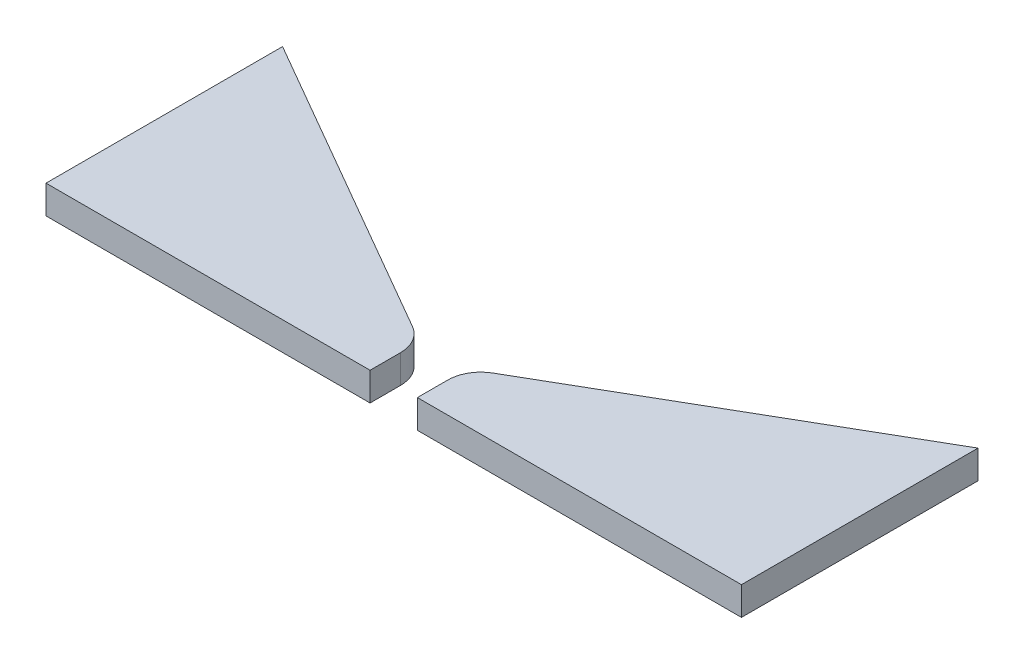
ISO-10303-21;
HEADER;
FILE_DESCRIPTION(('STEP AP214'),'2;1');
FILE_NAME('part.step','',(''),(''),'','','');
FILE_SCHEMA(('AUTOMOTIVE_DESIGN { 1 0 10303 214 1 1 1 1 }'));
ENDSEC;
DATA;
#1=APPLICATION_CONTEXT('core data for automotive mechanical design processes');
#2=APPLICATION_PROTOCOL_DEFINITION('international standard','automotive_design',2000,#1);
#3=PRODUCT_CONTEXT('',#1,'mechanical');
#4=PRODUCT('Part','Part','',(#3));
#5=PRODUCT_RELATED_PRODUCT_CATEGORY('part','',(#4));
#6=PRODUCT_DEFINITION_FORMATION('','',#4);
#7=PRODUCT_DEFINITION_CONTEXT('part definition',#1,'design');
#8=PRODUCT_DEFINITION('design','',#6,#7);
#9=PRODUCT_DEFINITION_SHAPE('','',#8);
#10=(LENGTH_UNIT() NAMED_UNIT(*) SI_UNIT(.MILLI.,.METRE.));
#11=(NAMED_UNIT(*) PLANE_ANGLE_UNIT() SI_UNIT($,.RADIAN.));
#12=(NAMED_UNIT(*) SI_UNIT($,.STERADIAN.) SOLID_ANGLE_UNIT());
#13=UNCERTAINTY_MEASURE_WITH_UNIT(LENGTH_MEASURE(1.E-05),#10,'distance_accuracy_value','');
#14=(GEOMETRIC_REPRESENTATION_CONTEXT(3) GLOBAL_UNCERTAINTY_ASSIGNED_CONTEXT((#13)) GLOBAL_UNIT_ASSIGNED_CONTEXT((#10,
#11,#12)) REPRESENTATION_CONTEXT('',''));
#15=CARTESIAN_POINT('',(0.,0.,0.));
#16=DIRECTION('',(0.,0.,1.));
#17=DIRECTION('',(1.,0.,0.));
#18=AXIS2_PLACEMENT_3D('',#15,#16,#17);
#19=CARTESIAN_POINT('',(-10.4001414253892,19.05,-18.0135733546757));
#20=DIRECTION('',(0.500000000000004,0.,0.866025403784436));
#21=DIRECTION('',(0.866025403784436,0.,-0.500000000000004));
#22=AXIS2_PLACEMENT_3D('',#19,#20,#21);
#23=PLANE('',#22);
#24=DIRECTION('',(-0.866025403784436,0.,0.500000000000004));
#25=VECTOR('',#24,1.);
#26=CARTESIAN_POINT('',(-10.4001414253892,0.,-18.0135733546757));
#27=LINE('',#26,#25);
#28=CARTESIAN_POINT('',(233.3625,0.,-158.75));
#29=VERTEX_POINT('',#28);
#30=CARTESIAN_POINT('',(26.9874999999999,0.,-39.5993381959896));
#31=VERTEX_POINT('',#30);
#32=EDGE_CURVE('E126',#29,#31,#27,.T.);
#33=ORIENTED_EDGE('',*,*,#32,.T.);
#34=DIRECTION('',(0.,-1.,0.));
#35=VECTOR('',#34,1.);
#36=CARTESIAN_POINT('',(26.9874999999999,19.05,-39.5993381959896));
#37=LINE('',#36,#35);
#38=CARTESIAN_POINT('',(26.9874999999999,19.05,-39.5993381959896));
#39=VERTEX_POINT('',#38);
#40=EDGE_CURVE('E12',#39,#31,#37,.T.);
#41=ORIENTED_EDGE('',*,*,#40,.F.);
#42=DIRECTION('',(-0.866025403784436,0.,0.500000000000004));
#43=VECTOR('',#42,1.);
#44=CARTESIAN_POINT('',(-10.4001414253892,19.05,-18.0135733546757));
#45=LINE('',#44,#43);
#46=CARTESIAN_POINT('',(233.3625,19.05,-158.75));
#47=VERTEX_POINT('',#46);
#48=EDGE_CURVE('E135',#47,#39,#45,.T.);
#49=ORIENTED_EDGE('',*,*,#48,.F.);
#50=DIRECTION('',(0.,-1.,0.));
#51=VECTOR('',#50,1.);
#52=CARTESIAN_POINT('',(233.3625,19.05,-158.75));
#53=LINE('',#52,#51);
#54=EDGE_CURVE('E122',#47,#29,#53,.T.);
#55=ORIENTED_EDGE('',*,*,#54,.T.);
#56=EDGE_LOOP('',(#33,#41,#49,#55));
#57=FACE_BOUND('',#56,.T.);
#58=ADVANCED_FACE('F49',(#57),#23,.F.);
#59=CARTESIAN_POINT('',(38.1,19.05,-20.3519235968805));
#60=DIRECTION('',(0.,-1.,0.));
#61=DIRECTION('',(0.,0.,-1.));
#62=AXIS2_PLACEMENT_3D('',#59,#60,#61);
#63=CYLINDRICAL_SURFACE('',#62,22.225);
#64=CARTESIAN_POINT('',(38.1,0.,-20.3519235968805));
#65=DIRECTION('',(0.,1.,0.));
#66=DIRECTION('',(0.,0.,1.));
#67=AXIS2_PLACEMENT_3D('',#64,#65,#66);
#68=CIRCLE('',#67,22.225);
#69=CARTESIAN_POINT('',(15.875,0.,-20.3519235968805));
#70=VERTEX_POINT('',#69);
#71=EDGE_CURVE('E129',#31,#70,#68,.T.);
#72=ORIENTED_EDGE('',*,*,#71,.T.);
#73=DIRECTION('',(0.,-1.,0.));
#74=VECTOR('',#73,1.);
#75=CARTESIAN_POINT('',(15.875,19.05,-20.3519235968805));
#76=LINE('',#75,#74);
#77=CARTESIAN_POINT('',(15.875,19.05,-20.3519235968805));
#78=VERTEX_POINT('',#77);
#79=EDGE_CURVE('E57',#78,#70,#76,.T.);
#80=ORIENTED_EDGE('',*,*,#79,.F.);
#81=CARTESIAN_POINT('',(38.1,19.05,-20.3519235968805));
#82=DIRECTION('',(0.,1.,0.));
#83=DIRECTION('',(0.,0.,1.));
#84=AXIS2_PLACEMENT_3D('',#81,#82,#83);
#85=CIRCLE('',#84,22.225);
#86=EDGE_CURVE('E100',#39,#78,#85,.T.);
#87=ORIENTED_EDGE('',*,*,#86,.F.);
#88=ORIENTED_EDGE('',*,*,#40,.T.);
#89=EDGE_LOOP('',(#72,#80,#87,#88));
#90=FACE_BOUND('',#89,.T.);
#91=ADVANCED_FACE('F154',(#90),#63,.T.);
#92=CARTESIAN_POINT('',(15.875,19.05,0.));
#93=DIRECTION('',(1.,0.,0.));
#94=DIRECTION('',(0.,0.,-1.));
#95=AXIS2_PLACEMENT_3D('',#92,#93,#94);
#96=PLANE('',#95);
#97=DIRECTION('',(0.,0.,1.));
#98=VECTOR('',#97,1.);
#99=CARTESIAN_POINT('',(15.875,0.,0.));
#100=LINE('',#99,#98);
#101=CARTESIAN_POINT('',(15.875,0.,0.));
#102=VERTEX_POINT('',#101);
#103=EDGE_CURVE('E117',#70,#102,#100,.T.);
#104=ORIENTED_EDGE('',*,*,#103,.T.);
#105=DIRECTION('',(0.,-1.,0.));
#106=VECTOR('',#105,1.);
#107=CARTESIAN_POINT('',(15.875,19.05,0.));
#108=LINE('',#107,#106);
#109=CARTESIAN_POINT('',(15.875,19.05,0.));
#110=VERTEX_POINT('',#109);
#111=EDGE_CURVE('E114',#110,#102,#108,.T.);
#112=ORIENTED_EDGE('',*,*,#111,.F.);
#113=DIRECTION('',(0.,0.,1.));
#114=VECTOR('',#113,1.);
#115=CARTESIAN_POINT('',(15.875,19.05,0.));
#116=LINE('',#115,#114);
#117=EDGE_CURVE('E106',#78,#110,#116,.T.);
#118=ORIENTED_EDGE('',*,*,#117,.F.);
#119=ORIENTED_EDGE('',*,*,#79,.T.);
#120=EDGE_LOOP('',(#104,#112,#118,#119));
#121=FACE_BOUND('',#120,.T.);
#122=ADVANCED_FACE('F115',(#121),#96,.F.);
#123=CARTESIAN_POINT('',(0.,19.05,0.));
#124=DIRECTION('',(0.,0.,-1.));
#125=DIRECTION('',(-1.,0.,0.));
#126=AXIS2_PLACEMENT_3D('',#123,#124,#125);
#127=PLANE('',#126);
#128=DIRECTION('',(1.,0.,0.));
#129=VECTOR('',#128,1.);
#130=CARTESIAN_POINT('',(0.,0.,0.));
#131=LINE('',#130,#129);
#132=CARTESIAN_POINT('',(233.3625,0.,0.));
#133=VERTEX_POINT('',#132);
#134=EDGE_CURVE('E86',#102,#133,#131,.T.);
#135=ORIENTED_EDGE('',*,*,#134,.T.);
#136=DIRECTION('',(0.,-1.,0.));
#137=VECTOR('',#136,1.);
#138=CARTESIAN_POINT('',(233.3625,19.05,0.));
#139=LINE('',#138,#137);
#140=CARTESIAN_POINT('',(233.3625,19.05,0.));
#141=VERTEX_POINT('',#140);
#142=EDGE_CURVE('E118',#141,#133,#139,.T.);
#143=ORIENTED_EDGE('',*,*,#142,.F.);
#144=DIRECTION('',(1.,0.,0.));
#145=VECTOR('',#144,1.);
#146=CARTESIAN_POINT('',(0.,19.05,0.));
#147=LINE('',#146,#145);
#148=EDGE_CURVE('E110',#110,#141,#147,.T.);
#149=ORIENTED_EDGE('',*,*,#148,.F.);
#150=ORIENTED_EDGE('',*,*,#111,.T.);
#151=EDGE_LOOP('',(#135,#143,#149,#150));
#152=FACE_BOUND('',#151,.T.);
#153=ADVANCED_FACE('F120',(#152),#127,.F.);
#154=CARTESIAN_POINT('',(233.3625,19.05,0.));
#155=DIRECTION('',(-1.,0.,0.));
#156=DIRECTION('',(0.,0.,1.));
#157=AXIS2_PLACEMENT_3D('',#154,#155,#156);
#158=PLANE('',#157);
#159=DIRECTION('',(0.,0.,-1.));
#160=VECTOR('',#159,1.);
#161=CARTESIAN_POINT('',(233.3625,0.,0.));
#162=LINE('',#161,#160);
#163=EDGE_CURVE('E92',#133,#29,#162,.T.);
#164=ORIENTED_EDGE('',*,*,#163,.T.);
#165=ORIENTED_EDGE('',*,*,#54,.F.);
#166=DIRECTION('',(0.,0.,-1.));
#167=VECTOR('',#166,1.);
#168=CARTESIAN_POINT('',(233.3625,19.05,0.));
#169=LINE('',#168,#167);
#170=EDGE_CURVE('E65',#141,#47,#169,.T.);
#171=ORIENTED_EDGE('',*,*,#170,.F.);
#172=ORIENTED_EDGE('',*,*,#142,.T.);
#173=EDGE_LOOP('',(#164,#165,#171,#172));
#174=FACE_BOUND('',#173,.T.);
#175=ADVANCED_FACE('F143',(#174),#158,.F.);
#176=CARTESIAN_POINT('',(0.,19.05,0.));
#177=DIRECTION('',(0.,1.,0.));
#178=DIRECTION('',(0.,0.,1.));
#179=AXIS2_PLACEMENT_3D('',#176,#177,#178);
#180=PLANE('',#179);
#181=ORIENTED_EDGE('',*,*,#48,.T.);
#182=ORIENTED_EDGE('',*,*,#86,.T.);
#183=ORIENTED_EDGE('',*,*,#117,.T.);
#184=ORIENTED_EDGE('',*,*,#148,.T.);
#185=ORIENTED_EDGE('',*,*,#170,.T.);
#186=EDGE_LOOP('',(#181,#182,#183,#184,#185));
#187=FACE_BOUND('',#186,.T.);
#188=ADVANCED_FACE('F108',(#187),#180,.T.);
#189=CARTESIAN_POINT('',(0.,0.,0.));
#190=DIRECTION('',(0.,1.,0.));
#191=DIRECTION('',(0.,0.,1.));
#192=AXIS2_PLACEMENT_3D('',#189,#190,#191);
#193=PLANE('',#192);
#194=CARTESIAN_POINT('',(207.9625,0.,-101.6));
#195=DIRECTION('',(0.,-1.,0.));
#196=DIRECTION('',(0.,0.,-1.));
#197=AXIS2_PLACEMENT_3D('',#194,#195,#196);
#198=CIRCLE('',#197,1.58749999999999);
#199=CARTESIAN_POINT('',(207.9625,0.,-103.1875));
#200=VERTEX_POINT('',#199);
#201=EDGE_CURVE('E254',#200,#200,#198,.T.);
#202=ORIENTED_EDGE('',*,*,#201,.F.);
#203=EDGE_LOOP('',(#202));
#204=FACE_BOUND('',#203,.T.);
#205=CARTESIAN_POINT('',(207.9625,0.,-25.4));
#206=DIRECTION('',(0.,-1.,0.));
#207=DIRECTION('',(0.,0.,-1.));
#208=AXIS2_PLACEMENT_3D('',#205,#206,#207);
#209=CIRCLE('',#208,1.58749999999999);
#210=CARTESIAN_POINT('',(207.9625,0.,-26.9875));
#211=VERTEX_POINT('',#210);
#212=EDGE_CURVE('E256',#211,#211,#209,.T.);
#213=ORIENTED_EDGE('',*,*,#212,.F.);
#214=EDGE_LOOP('',(#213));
#215=FACE_BOUND('',#214,.T.);
#216=CARTESIAN_POINT('',(68.2625,0.,-25.4));
#217=DIRECTION('',(0.,-1.,0.));
#218=DIRECTION('',(0.,0.,-1.));
#219=AXIS2_PLACEMENT_3D('',#216,#217,#218);
#220=CIRCLE('',#219,1.58749999999999);
#221=CARTESIAN_POINT('',(68.2625,0.,-26.9875));
#222=VERTEX_POINT('',#221);
#223=EDGE_CURVE('E264',#222,#222,#220,.T.);
#224=ORIENTED_EDGE('',*,*,#223,.F.);
#225=EDGE_LOOP('',(#224));
#226=FACE_BOUND('',#225,.T.);
#227=ORIENTED_EDGE('',*,*,#32,.F.);
#228=ORIENTED_EDGE('',*,*,#163,.F.);
#229=ORIENTED_EDGE('',*,*,#134,.F.);
#230=ORIENTED_EDGE('',*,*,#103,.F.);
#231=ORIENTED_EDGE('',*,*,#71,.F.);
#232=EDGE_LOOP('',(#227,#228,#229,#230,#231));
#233=FACE_BOUND('',#232,.T.);
#234=ADVANCED_FACE('F139',(#204,#215,#226,#233),#193,.F.);
#235=CARTESIAN_POINT('',(68.2625,11.1125,-25.4));
#236=DIRECTION('',(0.,-1.,0.));
#237=DIRECTION('',(0.,0.,-1.));
#238=AXIS2_PLACEMENT_3D('',#235,#236,#237);
#239=CONICAL_SURFACE('',#238,1.58749999999999,1.02974425867665);
#240=CARTESIAN_POINT('',(68.2625,12.0663662327063,-25.4));
#241=VERTEX_POINT('',#240);
#242=VERTEX_LOOP('',#241);
#243=FACE_BOUND('',#242,.T.);
#244=CARTESIAN_POINT('',(68.2625,11.1125,-25.4));
#245=DIRECTION('',(0.,-1.,0.));
#246=DIRECTION('',(0.,0.,-1.));
#247=AXIS2_PLACEMENT_3D('',#244,#245,#246);
#248=CIRCLE('',#247,1.58749999999999);
#249=CARTESIAN_POINT('',(68.2625,11.1125,-26.9875));
#250=VERTEX_POINT('',#249);
#251=EDGE_CURVE('E130',#250,#250,#248,.T.);
#252=ORIENTED_EDGE('',*,*,#251,.T.);
#253=EDGE_LOOP('',(#252));
#254=FACE_BOUND('',#253,.T.);
#255=ADVANCED_FACE('F187',(#243,#254),#239,.F.);
#256=CARTESIAN_POINT('',(68.2625,0.,-25.4));
#257=DIRECTION('',(0.,-1.,0.));
#258=DIRECTION('',(0.,0.,-1.));
#259=AXIS2_PLACEMENT_3D('',#256,#257,#258);
#260=CYLINDRICAL_SURFACE('',#259,1.58749999999999);
#261=ORIENTED_EDGE('',*,*,#251,.F.);
#262=EDGE_LOOP('',(#261));
#263=FACE_BOUND('',#262,.T.);
#264=ORIENTED_EDGE('',*,*,#223,.T.);
#265=EDGE_LOOP('',(#264));
#266=FACE_BOUND('',#265,.T.);
#267=ADVANCED_FACE('F194',(#263,#266),#260,.F.);
#268=CARTESIAN_POINT('',(207.9625,11.1125,-25.4));
#269=DIRECTION('',(0.,-1.,0.));
#270=DIRECTION('',(0.,0.,-1.));
#271=AXIS2_PLACEMENT_3D('',#268,#269,#270);
#272=CONICAL_SURFACE('',#271,1.58749999999999,1.02974425867665);
#273=CARTESIAN_POINT('',(207.9625,12.0663662327063,-25.4));
#274=VERTEX_POINT('',#273);
#275=VERTEX_LOOP('',#274);
#276=FACE_BOUND('',#275,.T.);
#277=CARTESIAN_POINT('',(207.9625,11.1125,-25.4));
#278=DIRECTION('',(0.,-1.,0.));
#279=DIRECTION('',(0.,0.,-1.));
#280=AXIS2_PLACEMENT_3D('',#277,#278,#279);
#281=CIRCLE('',#280,1.58749999999999);
#282=CARTESIAN_POINT('',(207.9625,11.1125,-26.9875));
#283=VERTEX_POINT('',#282);
#284=EDGE_CURVE('E261',#283,#283,#281,.T.);
#285=ORIENTED_EDGE('',*,*,#284,.T.);
#286=EDGE_LOOP('',(#285));
#287=FACE_BOUND('',#286,.T.);
#288=ADVANCED_FACE('F204',(#276,#287),#272,.F.);
#289=CARTESIAN_POINT('',(207.9625,0.,-25.4));
#290=DIRECTION('',(0.,-1.,0.));
#291=DIRECTION('',(0.,0.,-1.));
#292=AXIS2_PLACEMENT_3D('',#289,#290,#291);
#293=CYLINDRICAL_SURFACE('',#292,1.58749999999999);
#294=ORIENTED_EDGE('',*,*,#284,.F.);
#295=EDGE_LOOP('',(#294));
#296=FACE_BOUND('',#295,.T.);
#297=ORIENTED_EDGE('',*,*,#212,.T.);
#298=EDGE_LOOP('',(#297));
#299=FACE_BOUND('',#298,.T.);
#300=ADVANCED_FACE('F214',(#296,#299),#293,.F.);
#301=CARTESIAN_POINT('',(207.9625,11.1125,-101.6));
#302=DIRECTION('',(0.,-1.,0.));
#303=DIRECTION('',(0.,0.,-1.));
#304=AXIS2_PLACEMENT_3D('',#301,#302,#303);
#305=CONICAL_SURFACE('',#304,1.58749999999999,1.02974425867665);
#306=CARTESIAN_POINT('',(207.9625,12.0663662327063,-101.6));
#307=VERTEX_POINT('',#306);
#308=VERTEX_LOOP('',#307);
#309=FACE_BOUND('',#308,.T.);
#310=CARTESIAN_POINT('',(207.9625,11.1125,-101.6));
#311=DIRECTION('',(0.,-1.,0.));
#312=DIRECTION('',(0.,0.,-1.));
#313=AXIS2_PLACEMENT_3D('',#310,#311,#312);
#314=CIRCLE('',#313,1.58749999999999);
#315=CARTESIAN_POINT('',(207.9625,11.1125,-103.1875));
#316=VERTEX_POINT('',#315);
#317=EDGE_CURVE('E251',#316,#316,#314,.T.);
#318=ORIENTED_EDGE('',*,*,#317,.T.);
#319=EDGE_LOOP('',(#318));
#320=FACE_BOUND('',#319,.T.);
#321=ADVANCED_FACE('F224',(#309,#320),#305,.F.);
#322=CARTESIAN_POINT('',(207.9625,0.,-101.6));
#323=DIRECTION('',(0.,-1.,0.));
#324=DIRECTION('',(0.,0.,-1.));
#325=AXIS2_PLACEMENT_3D('',#322,#323,#324);
#326=CYLINDRICAL_SURFACE('',#325,1.58749999999999);
#327=ORIENTED_EDGE('',*,*,#317,.F.);
#328=EDGE_LOOP('',(#327));
#329=FACE_BOUND('',#328,.T.);
#330=ORIENTED_EDGE('',*,*,#201,.T.);
#331=EDGE_LOOP('',(#330));
#332=FACE_BOUND('',#331,.T.);
#333=ADVANCED_FACE('F234',(#329,#332),#326,.F.);
#334=CLOSED_SHELL('',(#58,#91,#122,#153,#175,#188,#234,#255,#267,#288,#300,#321,#333));
#335=MANIFOLD_SOLID_BREP('B2',#334);
#336=CARTESIAN_POINT('',(-38.1,19.05,-20.3519235968805));
#337=DIRECTION('',(0.,-1.,0.));
#338=DIRECTION('',(0.,0.,-1.));
#339=AXIS2_PLACEMENT_3D('',#336,#337,#338);
#340=CYLINDRICAL_SURFACE('',#339,22.225);
#341=CARTESIAN_POINT('',(-38.1,0.,-20.3519235968805));
#342=DIRECTION('',(0.,1.,0.));
#343=DIRECTION('',(0.,0.,1.));
#344=AXIS2_PLACEMENT_3D('',#341,#342,#343);
#345=CIRCLE('',#344,22.225);
#346=CARTESIAN_POINT('',(-26.9874999999999,0.,-39.5993381959898));
#347=VERTEX_POINT('',#346);
#348=CARTESIAN_POINT('',(-15.875,0.,-20.3519235968806));
#349=VERTEX_POINT('',#348);
#350=EDGE_CURVE('E379',#347,#349,#345,.F.);
#351=ORIENTED_EDGE('',*,*,#350,.F.);
#352=DIRECTION('',(0.,-1.,0.));
#353=VECTOR('',#352,1.);
#354=CARTESIAN_POINT('',(-26.9874999999999,19.05,-39.5993381959898));
#355=LINE('',#354,#353);
#356=CARTESIAN_POINT('',(-26.9874999999999,19.05,-39.5993381959898));
#357=VERTEX_POINT('',#356);
#358=EDGE_CURVE('E47',#357,#347,#355,.T.);
#359=ORIENTED_EDGE('',*,*,#358,.F.);
#360=CARTESIAN_POINT('',(-38.1,19.05,-20.3519235968805));
#361=DIRECTION('',(0.,1.,0.));
#362=DIRECTION('',(0.,0.,1.));
#363=AXIS2_PLACEMENT_3D('',#360,#361,#362);
#364=CIRCLE('',#363,22.225);
#365=CARTESIAN_POINT('',(-15.875,19.05,-20.3519235968806));
#366=VERTEX_POINT('',#365);
#367=EDGE_CURVE('E374',#357,#366,#364,.F.);
#368=ORIENTED_EDGE('',*,*,#367,.T.);
#369=DIRECTION('',(0.,-1.,0.));
#370=VECTOR('',#369,1.);
#371=CARTESIAN_POINT('',(-15.875,19.05,-20.3519235968806));
#372=LINE('',#371,#370);
#373=EDGE_CURVE('E317',#366,#349,#372,.T.);
#374=ORIENTED_EDGE('',*,*,#373,.T.);
#375=EDGE_LOOP('',(#351,#359,#368,#374));
#376=FACE_BOUND('',#375,.T.);
#377=ADVANCED_FACE('F301',(#376),#340,.T.);
#378=CARTESIAN_POINT('',(10.4001414253893,19.05,-18.0135733546759));
#379=DIRECTION('',(-0.500000000000004,0.,0.866025403784436));
#380=DIRECTION('',(0.866025403784437,0.,0.500000000000004));
#381=AXIS2_PLACEMENT_3D('',#378,#379,#380);
#382=PLANE('',#381);
#383=DIRECTION('',(-0.866025403784436,0.,-0.500000000000004));
#384=VECTOR('',#383,1.);
#385=CARTESIAN_POINT('',(10.4001414253893,0.,-18.0135733546759));
#386=LINE('',#385,#384);
#387=CARTESIAN_POINT('',(-233.3625,0.,-158.75));
#388=VERTEX_POINT('',#387);
#389=EDGE_CURVE('E381',#347,#388,#386,.T.);
#390=ORIENTED_EDGE('',*,*,#389,.T.);
#391=DIRECTION('',(0.,-1.,0.));
#392=VECTOR('',#391,1.);
#393=CARTESIAN_POINT('',(-233.3625,19.05,-158.75));
#394=LINE('',#393,#392);
#395=CARTESIAN_POINT('',(-233.3625,19.05,-158.75));
#396=VERTEX_POINT('',#395);
#397=EDGE_CURVE('E309',#396,#388,#394,.T.);
#398=ORIENTED_EDGE('',*,*,#397,.F.);
#399=DIRECTION('',(-0.866025403784436,0.,-0.500000000000004));
#400=VECTOR('',#399,1.);
#401=CARTESIAN_POINT('',(10.4001414253893,19.05,-18.0135733546759));
#402=LINE('',#401,#400);
#403=EDGE_CURVE('E371',#357,#396,#402,.T.);
#404=ORIENTED_EDGE('',*,*,#403,.F.);
#405=ORIENTED_EDGE('',*,*,#358,.T.);
#406=EDGE_LOOP('',(#390,#398,#404,#405));
#407=FACE_BOUND('',#406,.T.);
#408=ADVANCED_FACE('F394',(#407),#382,.F.);
#409=CARTESIAN_POINT('',(-233.3625,19.05,0.));
#410=DIRECTION('',(-1.,0.,0.));
#411=DIRECTION('',(0.,0.,1.));
#412=AXIS2_PLACEMENT_3D('',#409,#410,#411);
#413=PLANE('',#412);
#414=DIRECTION('',(0.,0.,-1.));
#415=VECTOR('',#414,1.);
#416=CARTESIAN_POINT('',(-233.3625,0.,0.));
#417=LINE('',#416,#415);
#418=CARTESIAN_POINT('',(-233.3625,0.,0.));
#419=VERTEX_POINT('',#418);
#420=EDGE_CURVE('E359',#419,#388,#417,.T.);
#421=ORIENTED_EDGE('',*,*,#420,.F.);
#422=DIRECTION('',(0.,-1.,0.));
#423=VECTOR('',#422,1.);
#424=CARTESIAN_POINT('',(-233.3625,19.05,0.));
#425=LINE('',#424,#423);
#426=CARTESIAN_POINT('',(-233.3625,19.05,0.));
#427=VERTEX_POINT('',#426);
#428=EDGE_CURVE('E353',#427,#419,#425,.T.);
#429=ORIENTED_EDGE('',*,*,#428,.F.);
#430=DIRECTION('',(0.,0.,-1.));
#431=VECTOR('',#430,1.);
#432=CARTESIAN_POINT('',(-233.3625,19.05,0.));
#433=LINE('',#432,#431);
#434=EDGE_CURVE('E357',#427,#396,#433,.T.);
#435=ORIENTED_EDGE('',*,*,#434,.T.);
#436=ORIENTED_EDGE('',*,*,#397,.T.);
#437=EDGE_LOOP('',(#421,#429,#435,#436));
#438=FACE_BOUND('',#437,.T.);
#439=ADVANCED_FACE('F355',(#438),#413,.T.);
#440=CARTESIAN_POINT('',(0.,19.05,0.));
#441=DIRECTION('',(0.,0.,-1.));
#442=DIRECTION('',(-1.,0.,0.));
#443=AXIS2_PLACEMENT_3D('',#440,#441,#442);
#444=PLANE('',#443);
#445=DIRECTION('',(1.,0.,0.));
#446=VECTOR('',#445,1.);
#447=CARTESIAN_POINT('',(0.,0.,0.));
#448=LINE('',#447,#446);
#449=CARTESIAN_POINT('',(-15.875,0.,0.));
#450=VERTEX_POINT('',#449);
#451=EDGE_CURVE('E386',#419,#450,#448,.T.);
#452=ORIENTED_EDGE('',*,*,#451,.T.);
#453=DIRECTION('',(0.,-1.,0.));
#454=VECTOR('',#453,1.);
#455=CARTESIAN_POINT('',(-15.875,19.05,0.));
#456=LINE('',#455,#454);
#457=CARTESIAN_POINT('',(-15.875,19.05,0.));
#458=VERTEX_POINT('',#457);
#459=EDGE_CURVE('E335',#458,#450,#456,.T.);
#460=ORIENTED_EDGE('',*,*,#459,.F.);
#461=DIRECTION('',(1.,0.,0.));
#462=VECTOR('',#461,1.);
#463=CARTESIAN_POINT('',(0.,19.05,0.));
#464=LINE('',#463,#462);
#465=EDGE_CURVE('E363',#427,#458,#464,.T.);
#466=ORIENTED_EDGE('',*,*,#465,.F.);
#467=ORIENTED_EDGE('',*,*,#428,.T.);
#468=EDGE_LOOP('',(#452,#460,#466,#467));
#469=FACE_BOUND('',#468,.T.);
#470=ADVANCED_FACE('F364',(#469),#444,.F.);
#471=CARTESIAN_POINT('',(-15.875,19.05,0.));
#472=DIRECTION('',(1.,0.,0.));
#473=DIRECTION('',(0.,0.,-1.));
#474=AXIS2_PLACEMENT_3D('',#471,#472,#473);
#475=PLANE('',#474);
#476=DIRECTION('',(0.,0.,1.));
#477=VECTOR('',#476,1.);
#478=CARTESIAN_POINT('',(-15.875,0.,0.));
#479=LINE('',#478,#477);
#480=EDGE_CURVE('E388',#349,#450,#479,.T.);
#481=ORIENTED_EDGE('',*,*,#480,.F.);
#482=ORIENTED_EDGE('',*,*,#373,.F.);
#483=DIRECTION('',(0.,0.,1.));
#484=VECTOR('',#483,1.);
#485=CARTESIAN_POINT('',(-15.875,19.05,0.));
#486=LINE('',#485,#484);
#487=EDGE_CURVE('E367',#366,#458,#486,.T.);
#488=ORIENTED_EDGE('',*,*,#487,.T.);
#489=ORIENTED_EDGE('',*,*,#459,.T.);
#490=EDGE_LOOP('',(#481,#482,#488,#489));
#491=FACE_BOUND('',#490,.T.);
#492=ADVANCED_FACE('F397',(#491),#475,.T.);
#493=CARTESIAN_POINT('',(0.,19.05,0.));
#494=DIRECTION('',(0.,1.,0.));
#495=DIRECTION('',(0.,0.,1.));
#496=AXIS2_PLACEMENT_3D('',#493,#494,#495);
#497=PLANE('',#496);
#498=ORIENTED_EDGE('',*,*,#367,.F.);
#499=ORIENTED_EDGE('',*,*,#403,.T.);
#500=ORIENTED_EDGE('',*,*,#434,.F.);
#501=ORIENTED_EDGE('',*,*,#465,.T.);
#502=ORIENTED_EDGE('',*,*,#487,.F.);
#503=EDGE_LOOP('',(#498,#499,#500,#501,#502));
#504=FACE_BOUND('',#503,.T.);
#505=ADVANCED_FACE('F370',(#504),#497,.T.);
#506=CARTESIAN_POINT('',(0.,0.,0.));
#507=DIRECTION('',(0.,1.,0.));
#508=DIRECTION('',(0.,0.,1.));
#509=AXIS2_PLACEMENT_3D('',#506,#507,#508);
#510=PLANE('',#509);
#511=CARTESIAN_POINT('',(-68.2625,0.,-25.4));
#512=DIRECTION('',(0.,-1.,0.));
#513=DIRECTION('',(0.,0.,-1.));
#514=AXIS2_PLACEMENT_3D('',#511,#512,#513);
#515=CIRCLE('',#514,1.58749999999999);
#516=CARTESIAN_POINT('',(-68.2625,0.,-26.9875));
#517=VERTEX_POINT('',#516);
#518=EDGE_CURVE('E507',#517,#517,#515,.T.);
#519=ORIENTED_EDGE('',*,*,#518,.F.);
#520=EDGE_LOOP('',(#519));
#521=FACE_BOUND('',#520,.T.);
#522=CARTESIAN_POINT('',(-207.9625,0.,-25.4));
#523=DIRECTION('',(0.,-1.,0.));
#524=DIRECTION('',(0.,0.,-1.));
#525=AXIS2_PLACEMENT_3D('',#522,#523,#524);
#526=CIRCLE('',#525,1.58749999999999);
#527=CARTESIAN_POINT('',(-207.9625,0.,-26.9875));
#528=VERTEX_POINT('',#527);
#529=EDGE_CURVE('E509',#528,#528,#526,.T.);
#530=ORIENTED_EDGE('',*,*,#529,.F.);
#531=EDGE_LOOP('',(#530));
#532=FACE_BOUND('',#531,.T.);
#533=CARTESIAN_POINT('',(-207.9625,0.,-101.6));
#534=DIRECTION('',(0.,-1.,0.));
#535=DIRECTION('',(0.,0.,-1.));
#536=AXIS2_PLACEMENT_3D('',#533,#534,#535);
#537=CIRCLE('',#536,1.58749999999999);
#538=CARTESIAN_POINT('',(-207.9625,0.,-103.1875));
#539=VERTEX_POINT('',#538);
#540=EDGE_CURVE('E517',#539,#539,#537,.T.);
#541=ORIENTED_EDGE('',*,*,#540,.F.);
#542=EDGE_LOOP('',(#541));
#543=FACE_BOUND('',#542,.T.);
#544=ORIENTED_EDGE('',*,*,#350,.T.);
#545=ORIENTED_EDGE('',*,*,#480,.T.);
#546=ORIENTED_EDGE('',*,*,#451,.F.);
#547=ORIENTED_EDGE('',*,*,#420,.T.);
#548=ORIENTED_EDGE('',*,*,#389,.F.);
#549=EDGE_LOOP('',(#544,#545,#546,#547,#548));
#550=FACE_BOUND('',#549,.T.);
#551=ADVANCED_FACE('F396',(#521,#532,#543,#550),#510,.F.);
#552=CARTESIAN_POINT('',(-207.9625,11.1125,-101.6));
#553=DIRECTION('',(0.,-1.,0.));
#554=DIRECTION('',(0.,0.,-1.));
#555=AXIS2_PLACEMENT_3D('',#552,#553,#554);
#556=CONICAL_SURFACE('',#555,1.58749999999999,1.02974425867665);
#557=CARTESIAN_POINT('',(-207.9625,12.0663662327063,-101.6));
#558=VERTEX_POINT('',#557);
#559=VERTEX_LOOP('',#558);
#560=FACE_BOUND('',#559,.T.);
#561=CARTESIAN_POINT('',(-207.9625,11.1125,-101.6));
#562=DIRECTION('',(0.,-1.,0.));
#563=DIRECTION('',(0.,0.,-1.));
#564=AXIS2_PLACEMENT_3D('',#561,#562,#563);
#565=CIRCLE('',#564,1.58749999999999);
#566=CARTESIAN_POINT('',(-207.9625,11.1125,-103.1875));
#567=VERTEX_POINT('',#566);
#568=EDGE_CURVE('E382',#567,#567,#565,.T.);
#569=ORIENTED_EDGE('',*,*,#568,.T.);
#570=EDGE_LOOP('',(#569));
#571=FACE_BOUND('',#570,.T.);
#572=ADVANCED_FACE('F440',(#560,#571),#556,.F.);
#573=CARTESIAN_POINT('',(-207.9625,0.,-101.6));
#574=DIRECTION('',(0.,-1.,0.));
#575=DIRECTION('',(0.,0.,-1.));
#576=AXIS2_PLACEMENT_3D('',#573,#574,#575);
#577=CYLINDRICAL_SURFACE('',#576,1.58749999999999);
#578=ORIENTED_EDGE('',*,*,#568,.F.);
#579=EDGE_LOOP('',(#578));
#580=FACE_BOUND('',#579,.T.);
#581=ORIENTED_EDGE('',*,*,#540,.T.);
#582=EDGE_LOOP('',(#581));
#583=FACE_BOUND('',#582,.T.);
#584=ADVANCED_FACE('F447',(#580,#583),#577,.F.);
#585=CARTESIAN_POINT('',(-207.9625,11.1125,-25.4));
#586=DIRECTION('',(0.,-1.,0.));
#587=DIRECTION('',(0.,0.,-1.));
#588=AXIS2_PLACEMENT_3D('',#585,#586,#587);
#589=CONICAL_SURFACE('',#588,1.58749999999999,1.02974425867665);
#590=CARTESIAN_POINT('',(-207.9625,12.0663662327063,-25.4));
#591=VERTEX_POINT('',#590);
#592=VERTEX_LOOP('',#591);
#593=FACE_BOUND('',#592,.T.);
#594=CARTESIAN_POINT('',(-207.9625,11.1125,-25.4));
#595=DIRECTION('',(0.,-1.,0.));
#596=DIRECTION('',(0.,0.,-1.));
#597=AXIS2_PLACEMENT_3D('',#594,#595,#596);
#598=CIRCLE('',#597,1.58749999999999);
#599=CARTESIAN_POINT('',(-207.9625,11.1125,-26.9875));
#600=VERTEX_POINT('',#599);
#601=EDGE_CURVE('E514',#600,#600,#598,.T.);
#602=ORIENTED_EDGE('',*,*,#601,.T.);
#603=EDGE_LOOP('',(#602));
#604=FACE_BOUND('',#603,.T.);
#605=ADVANCED_FACE('F457',(#593,#604),#589,.F.);
#606=CARTESIAN_POINT('',(-207.9625,0.,-25.4));
#607=DIRECTION('',(0.,-1.,0.));
#608=DIRECTION('',(0.,0.,-1.));
#609=AXIS2_PLACEMENT_3D('',#606,#607,#608);
#610=CYLINDRICAL_SURFACE('',#609,1.58749999999999);
#611=ORIENTED_EDGE('',*,*,#601,.F.);
#612=EDGE_LOOP('',(#611));
#613=FACE_BOUND('',#612,.T.);
#614=ORIENTED_EDGE('',*,*,#529,.T.);
#615=EDGE_LOOP('',(#614));
#616=FACE_BOUND('',#615,.T.);
#617=ADVANCED_FACE('F467',(#613,#616),#610,.F.);
#618=CARTESIAN_POINT('',(-68.2625,11.1125,-25.4));
#619=DIRECTION('',(0.,-1.,0.));
#620=DIRECTION('',(0.,0.,-1.));
#621=AXIS2_PLACEMENT_3D('',#618,#619,#620);
#622=CONICAL_SURFACE('',#621,1.58749999999999,1.02974425867665);
#623=CARTESIAN_POINT('',(-68.2625,12.0663662327063,-25.4));
#624=VERTEX_POINT('',#623);
#625=VERTEX_LOOP('',#624);
#626=FACE_BOUND('',#625,.T.);
#627=CARTESIAN_POINT('',(-68.2625,11.1125,-25.4));
#628=DIRECTION('',(0.,-1.,0.));
#629=DIRECTION('',(0.,0.,-1.));
#630=AXIS2_PLACEMENT_3D('',#627,#628,#629);
#631=CIRCLE('',#630,1.58749999999999);
#632=CARTESIAN_POINT('',(-68.2625,11.1125,-26.9875));
#633=VERTEX_POINT('',#632);
#634=EDGE_CURVE('E504',#633,#633,#631,.T.);
#635=ORIENTED_EDGE('',*,*,#634,.T.);
#636=EDGE_LOOP('',(#635));
#637=FACE_BOUND('',#636,.T.);
#638=ADVANCED_FACE('F477',(#626,#637),#622,.F.);
#639=CARTESIAN_POINT('',(-68.2625,0.,-25.4));
#640=DIRECTION('',(0.,-1.,0.));
#641=DIRECTION('',(0.,0.,-1.));
#642=AXIS2_PLACEMENT_3D('',#639,#640,#641);
#643=CYLINDRICAL_SURFACE('',#642,1.58749999999999);
#644=ORIENTED_EDGE('',*,*,#634,.F.);
#645=EDGE_LOOP('',(#644));
#646=FACE_BOUND('',#645,.T.);
#647=ORIENTED_EDGE('',*,*,#518,.T.);
#648=EDGE_LOOP('',(#647));
#649=FACE_BOUND('',#648,.T.);
#650=ADVANCED_FACE('F487',(#646,#649),#643,.F.);
#651=CLOSED_SHELL('',(#377,#408,#439,#470,#492,#505,#551,#572,#584,#605,#617,#638,#650));
#652=MANIFOLD_SOLID_BREP('B6',#651);
#653=ADVANCED_BREP_SHAPE_REPRESENTATION('',(#18,#335,#652),#14);
#654=SHAPE_DEFINITION_REPRESENTATION(#9,#653);
ENDSEC;
END-ISO-10303-21;
